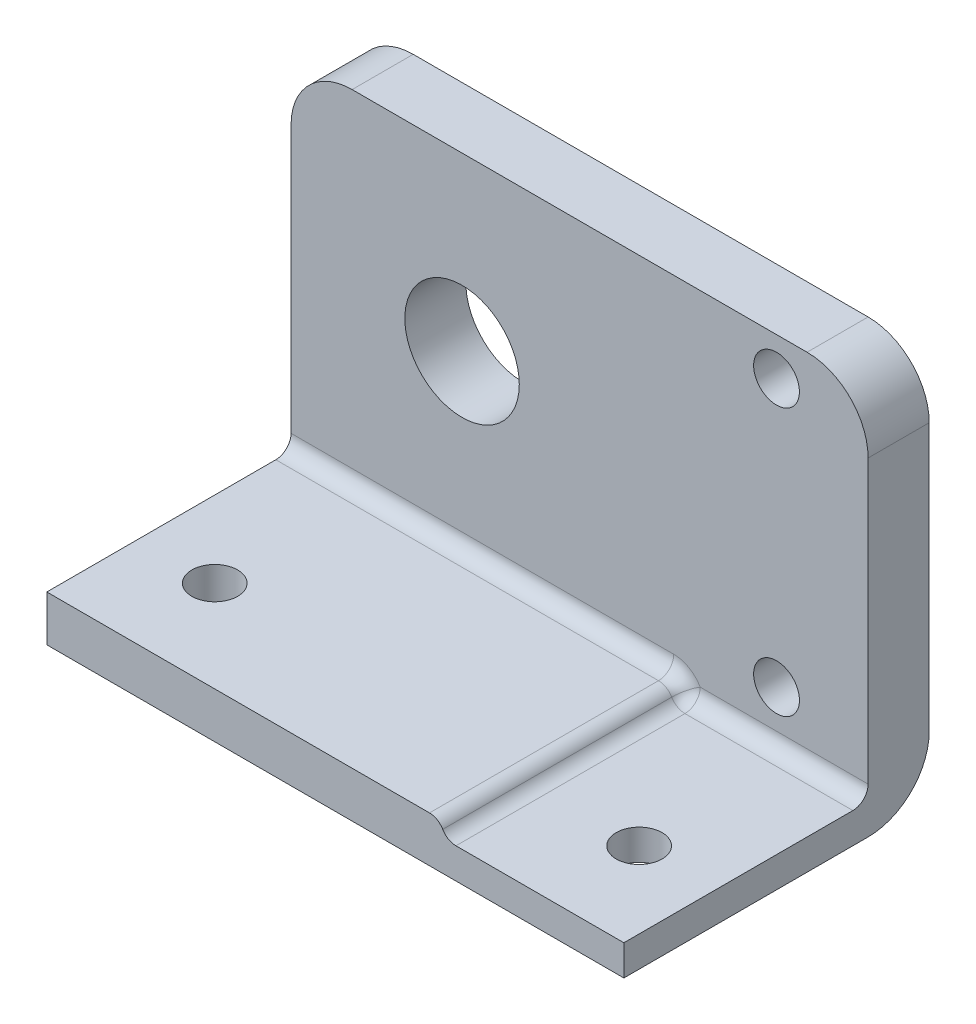
ISO-10303-21;
HEADER;
FILE_DESCRIPTION(('STEP AP214'),'2;1');
FILE_NAME('part.step','',(''),(''),'','','');
FILE_SCHEMA(('AUTOMOTIVE_DESIGN { 1 0 10303 214 1 1 1 1 }'));
ENDSEC;
DATA;
#1=APPLICATION_CONTEXT('core data for automotive mechanical design processes');
#2=APPLICATION_PROTOCOL_DEFINITION('international standard','automotive_design',2000,#1);
#3=PRODUCT_CONTEXT('',#1,'mechanical');
#4=PRODUCT('Part','Part','',(#3));
#5=PRODUCT_RELATED_PRODUCT_CATEGORY('part','',(#4));
#6=PRODUCT_DEFINITION_FORMATION('','',#4);
#7=PRODUCT_DEFINITION_CONTEXT('part definition',#1,'design');
#8=PRODUCT_DEFINITION('design','',#6,#7);
#9=PRODUCT_DEFINITION_SHAPE('','',#8);
#10=(LENGTH_UNIT() NAMED_UNIT(*) SI_UNIT(.MILLI.,.METRE.));
#11=(NAMED_UNIT(*) PLANE_ANGLE_UNIT() SI_UNIT($,.RADIAN.));
#12=(NAMED_UNIT(*) SI_UNIT($,.STERADIAN.) SOLID_ANGLE_UNIT());
#13=UNCERTAINTY_MEASURE_WITH_UNIT(LENGTH_MEASURE(1.E-05),#10,'distance_accuracy_value','');
#14=(GEOMETRIC_REPRESENTATION_CONTEXT(3) GLOBAL_UNCERTAINTY_ASSIGNED_CONTEXT((#13)) GLOBAL_UNIT_ASSIGNED_CONTEXT((#10,
#11,#12)) REPRESENTATION_CONTEXT('',''));
#15=CARTESIAN_POINT('',(0.,0.,0.));
#16=DIRECTION('',(0.,0.,1.));
#17=DIRECTION('',(1.,0.,0.));
#18=AXIS2_PLACEMENT_3D('',#15,#16,#17);
#19=CARTESIAN_POINT('',(0.,0.,0.));
#20=DIRECTION('',(0.,0.,1.));
#21=DIRECTION('',(1.,0.,0.));
#22=AXIS2_PLACEMENT_3D('',#19,#20,#21);
#23=PLANE('',#22);
#24=CARTESIAN_POINT('',(12.9,8.75,0.));
#25=DIRECTION('',(0.,0.,1.));
#26=DIRECTION('',(-1.,0.,0.));
#27=AXIS2_PLACEMENT_3D('',#24,#25,#26);
#28=CIRCLE('',#27,1.50000000000001);
#29=CARTESIAN_POINT('',(11.4,8.75,0.));
#30=VERTEX_POINT('',#29);
#31=EDGE_CURVE('E176',#30,#30,#28,.T.);
#32=ORIENTED_EDGE('',*,*,#31,.F.);
#33=EDGE_LOOP('',(#32));
#34=FACE_BOUND('',#33,.T.);
#35=CARTESIAN_POINT('',(-7.7,0.,0.));
#36=DIRECTION('',(0.,0.,1.));
#37=DIRECTION('',(1.,0.,0.));
#38=AXIS2_PLACEMENT_3D('',#35,#36,#37);
#39=CIRCLE('',#38,3.75);
#40=CARTESIAN_POINT('',(-3.95,0.,0.));
#41=VERTEX_POINT('',#40);
#42=EDGE_CURVE('E164',#41,#41,#39,.T.);
#43=ORIENTED_EDGE('',*,*,#42,.F.);
#44=EDGE_LOOP('',(#43));
#45=FACE_BOUND('',#44,.T.);
#46=CARTESIAN_POINT('',(12.9,-8.75,0.));
#47=DIRECTION('',(0.,0.,1.));
#48=DIRECTION('',(1.,0.,0.));
#49=AXIS2_PLACEMENT_3D('',#46,#47,#48);
#50=CIRCLE('',#49,1.5);
#51=CARTESIAN_POINT('',(14.4,-8.75,0.));
#52=VERTEX_POINT('',#51);
#53=EDGE_CURVE('E181',#52,#52,#50,.T.);
#54=ORIENTED_EDGE('',*,*,#53,.F.);
#55=EDGE_LOOP('',(#54));
#56=FACE_BOUND('',#55,.T.);
#57=CARTESIAN_POINT('',(6.16794919243111,-12.25,0.));
#58=DIRECTION('',(0.,0.,1.));
#59=DIRECTION('',(1.,0.,0.));
#60=AXIS2_PLACEMENT_3D('',#57,#58,#59);
#61=CIRCLE('',#60,2.);
#62=CARTESIAN_POINT('',(7.89999999999999,-11.25,0.));
#63=VERTEX_POINT('',#62);
#64=CARTESIAN_POINT('',(6.16794919243111,-10.25,0.));
#65=VERTEX_POINT('',#64);
#66=EDGE_CURVE('E258',#63,#65,#61,.T.);
#67=ORIENTED_EDGE('',*,*,#66,.F.);
#68=DIRECTION('',(1.,0.,0.));
#69=VECTOR('',#68,1.);
#70=CARTESIAN_POINT('',(18.9,-11.25,0.));
#71=LINE('',#70,#69);
#72=CARTESIAN_POINT('',(18.9,-11.25,0.));
#73=VERTEX_POINT('',#72);
#74=EDGE_CURVE('E253',#63,#73,#71,.T.);
#75=ORIENTED_EDGE('',*,*,#74,.T.);
#76=DIRECTION('',(0.,1.,0.));
#77=VECTOR('',#76,1.);
#78=CARTESIAN_POINT('',(18.9,11.25,0.));
#79=LINE('',#78,#77);
#80=CARTESIAN_POINT('',(18.9,7.25,0.));
#81=VERTEX_POINT('',#80);
#82=EDGE_CURVE('E190',#73,#81,#79,.T.);
#83=ORIENTED_EDGE('',*,*,#82,.T.);
#84=CARTESIAN_POINT('',(14.9,7.25,0.));
#85=DIRECTION('',(0.,0.,1.));
#86=DIRECTION('',(1.,0.,0.));
#87=AXIS2_PLACEMENT_3D('',#84,#85,#86);
#88=CIRCLE('',#87,4.);
#89=CARTESIAN_POINT('',(14.9,11.25,0.));
#90=VERTEX_POINT('',#89);
#91=EDGE_CURVE('E230',#81,#90,#88,.T.);
#92=ORIENTED_EDGE('',*,*,#91,.T.);
#93=DIRECTION('',(-1.,0.,0.));
#94=VECTOR('',#93,1.);
#95=CARTESIAN_POINT('',(-18.9,11.25,0.));
#96=LINE('',#95,#94);
#97=CARTESIAN_POINT('',(-14.9,11.25,0.));
#98=VERTEX_POINT('',#97);
#99=EDGE_CURVE('E203',#90,#98,#96,.T.);
#100=ORIENTED_EDGE('',*,*,#99,.T.);
#101=CARTESIAN_POINT('',(-14.9,7.25,0.));
#102=DIRECTION('',(0.,0.,1.));
#103=DIRECTION('',(1.,0.,0.));
#104=AXIS2_PLACEMENT_3D('',#101,#102,#103);
#105=CIRCLE('',#104,4.);
#106=CARTESIAN_POINT('',(-18.9,7.25,0.));
#107=VERTEX_POINT('',#106);
#108=EDGE_CURVE('E227',#98,#107,#105,.T.);
#109=ORIENTED_EDGE('',*,*,#108,.T.);
#110=DIRECTION('',(0.,-1.,0.));
#111=VECTOR('',#110,1.);
#112=CARTESIAN_POINT('',(-18.9,11.25,0.));
#113=LINE('',#112,#111);
#114=CARTESIAN_POINT('',(-18.9,-10.25,0.));
#115=VERTEX_POINT('',#114);
#116=EDGE_CURVE('E193',#107,#115,#113,.T.);
#117=ORIENTED_EDGE('',*,*,#116,.T.);
#118=DIRECTION('',(1.,0.,0.));
#119=VECTOR('',#118,1.);
#120=CARTESIAN_POINT('',(18.9,-10.25,0.));
#121=LINE('',#120,#119);
#122=EDGE_CURVE('E200',#115,#65,#121,.T.);
#123=ORIENTED_EDGE('',*,*,#122,.T.);
#124=EDGE_LOOP('',(#67,#75,#83,#92,#100,#109,#117,#123));
#125=FACE_BOUND('',#124,.T.);
#126=ADVANCED_FACE('F41',(#34,#45,#56,#125),#23,.T.);
#127=CARTESIAN_POINT('',(18.9,11.25,-4.));
#128=DIRECTION('',(1.,0.,0.));
#129=DIRECTION('',(0.,0.,-1.));
#130=AXIS2_PLACEMENT_3D('',#127,#128,#129);
#131=PLANE('',#130);
#132=ORIENTED_EDGE('',*,*,#82,.F.);
#133=CARTESIAN_POINT('',(18.9,-11.25,1.));
#134=DIRECTION('',(1.,0.,0.));
#135=DIRECTION('',(0.,0.,-1.));
#136=AXIS2_PLACEMENT_3D('',#133,#134,#135);
#137=CIRCLE('',#136,1.);
#138=CARTESIAN_POINT('',(18.9,-12.25,1.));
#139=VERTEX_POINT('',#138);
#140=EDGE_CURVE('E11',#73,#139,#137,.F.);
#141=ORIENTED_EDGE('',*,*,#140,.T.);
#142=DIRECTION('',(0.,0.,1.));
#143=VECTOR('',#142,1.);
#144=CARTESIAN_POINT('',(18.9,-12.25,-14.6866079723341));
#145=LINE('',#144,#143);
#146=CARTESIAN_POINT('',(18.9,-12.25,16.));
#147=VERTEX_POINT('',#146);
#148=EDGE_CURVE('E144',#139,#147,#145,.T.);
#149=ORIENTED_EDGE('',*,*,#148,.T.);
#150=DIRECTION('',(0.,1.,0.));
#151=VECTOR('',#150,1.);
#152=CARTESIAN_POINT('',(18.9,-14.25,16.));
#153=LINE('',#152,#151);
#154=CARTESIAN_POINT('',(18.9,-14.25,16.));
#155=VERTEX_POINT('',#154);
#156=EDGE_CURVE('E148',#155,#147,#153,.T.);
#157=ORIENTED_EDGE('',*,*,#156,.F.);
#158=DIRECTION('',(0.,0.,1.));
#159=VECTOR('',#158,1.);
#160=CARTESIAN_POINT('',(18.9,-14.25,-4.));
#161=LINE('',#160,#159);
#162=CARTESIAN_POINT('',(18.9,-14.25,0.));
#163=VERTEX_POINT('',#162);
#164=EDGE_CURVE('E327',#163,#155,#161,.T.);
#165=ORIENTED_EDGE('',*,*,#164,.F.);
#166=CARTESIAN_POINT('',(18.9,-10.25,0.));
#167=DIRECTION('',(1.,0.,0.));
#168=DIRECTION('',(0.,0.,-1.));
#169=AXIS2_PLACEMENT_3D('',#166,#167,#168);
#170=CIRCLE('',#169,4.);
#171=CARTESIAN_POINT('',(18.9,-10.25,-4.));
#172=VERTEX_POINT('',#171);
#173=EDGE_CURVE('E212',#163,#172,#170,.T.);
#174=ORIENTED_EDGE('',*,*,#173,.T.);
#175=DIRECTION('',(0.,1.,0.));
#176=VECTOR('',#175,1.);
#177=CARTESIAN_POINT('',(18.9,11.25,-4.));
#178=LINE('',#177,#176);
#179=CARTESIAN_POINT('',(18.9,7.25,-4.));
#180=VERTEX_POINT('',#179);
#181=EDGE_CURVE('E188',#172,#180,#178,.T.);
#182=ORIENTED_EDGE('',*,*,#181,.T.);
#183=DIRECTION('',(0.,0.,1.));
#184=VECTOR('',#183,1.);
#185=CARTESIAN_POINT('',(18.9,7.25,-4.));
#186=LINE('',#185,#184);
#187=EDGE_CURVE('E222',#180,#81,#186,.T.);
#188=ORIENTED_EDGE('',*,*,#187,.T.);
#189=EDGE_LOOP('',(#132,#141,#149,#157,#165,#174,#182,#188));
#190=FACE_BOUND('',#189,.T.);
#191=ADVANCED_FACE('F149',(#190),#131,.T.);
#192=CARTESIAN_POINT('',(0.,-11.25,0.));
#193=DIRECTION('',(0.,1.,0.));
#194=DIRECTION('',(0.,0.,1.));
#195=AXIS2_PLACEMENT_3D('',#192,#193,#194);
#196=PLANE('',#195);
#197=CARTESIAN_POINT('',(-13.9,-11.25,10.));
#198=DIRECTION('',(0.,-1.,0.));
#199=DIRECTION('',(0.,0.,-1.));
#200=AXIS2_PLACEMENT_3D('',#197,#198,#199);
#201=CIRCLE('',#200,1.5);
#202=CARTESIAN_POINT('',(-13.9,-11.25,8.5));
#203=VERTEX_POINT('',#202);
#204=EDGE_CURVE('E323',#203,#203,#201,.T.);
#205=ORIENTED_EDGE('',*,*,#204,.T.);
#206=EDGE_LOOP('',(#205));
#207=FACE_BOUND('',#206,.T.);
#208=DIRECTION('',(-1.,0.,0.));
#209=VECTOR('',#208,1.);
#210=CARTESIAN_POINT('',(-18.9,-11.25,16.));
#211=LINE('',#210,#209);
#212=CARTESIAN_POINT('',(6.16794919243111,-11.25,16.));
#213=VERTEX_POINT('',#212);
#214=CARTESIAN_POINT('',(-18.9,-11.25,16.));
#215=VERTEX_POINT('',#214);
#216=EDGE_CURVE('E311',#213,#215,#211,.T.);
#217=ORIENTED_EDGE('',*,*,#216,.F.);
#218=DIRECTION('',(0.,0.,1.));
#219=VECTOR('',#218,1.);
#220=CARTESIAN_POINT('',(6.16794919243111,-11.25,1.));
#221=LINE('',#220,#219);
#222=CARTESIAN_POINT('',(6.16794919243111,-11.25,1.));
#223=VERTEX_POINT('',#222);
#224=EDGE_CURVE('E249',#213,#223,#221,.F.);
#225=ORIENTED_EDGE('',*,*,#224,.T.);
#226=DIRECTION('',(1.,0.,0.));
#227=VECTOR('',#226,1.);
#228=CARTESIAN_POINT('',(-18.9,-11.25,1.));
#229=LINE('',#228,#227);
#230=CARTESIAN_POINT('',(-18.9,-11.25,1.));
#231=VERTEX_POINT('',#230);
#232=EDGE_CURVE('E210',#223,#231,#229,.F.);
#233=ORIENTED_EDGE('',*,*,#232,.T.);
#234=DIRECTION('',(0.,0.,-1.));
#235=VECTOR('',#234,1.);
#236=CARTESIAN_POINT('',(-18.9,-11.25,-4.));
#237=LINE('',#236,#235);
#238=EDGE_CURVE('E301',#215,#231,#237,.T.);
#239=ORIENTED_EDGE('',*,*,#238,.F.);
#240=EDGE_LOOP('',(#217,#225,#233,#239));
#241=FACE_BOUND('',#240,.T.);
#242=ADVANCED_FACE('F309',(#207,#241),#196,.T.);
#243=CARTESIAN_POINT('',(13.9,-14.25,10.));
#244=DIRECTION('',(0.,1.,0.));
#245=DIRECTION('',(0.,0.,1.));
#246=AXIS2_PLACEMENT_3D('',#243,#244,#245);
#247=CYLINDRICAL_SURFACE('',#246,1.5);
#248=CARTESIAN_POINT('',(13.9,-14.25,10.));
#249=DIRECTION('',(0.,-1.,0.));
#250=DIRECTION('',(0.,0.,-1.));
#251=AXIS2_PLACEMENT_3D('',#248,#249,#250);
#252=CIRCLE('',#251,1.5);
#253=CARTESIAN_POINT('',(13.9,-14.25,8.5));
#254=VERTEX_POINT('',#253);
#255=EDGE_CURVE('E242',#254,#254,#252,.T.);
#256=ORIENTED_EDGE('',*,*,#255,.T.);
#257=EDGE_LOOP('',(#256));
#258=FACE_BOUND('',#257,.T.);
#259=CARTESIAN_POINT('',(13.9,-12.25,10.));
#260=DIRECTION('',(0.,1.,0.));
#261=DIRECTION('',(-1.,0.,0.));
#262=AXIS2_PLACEMENT_3D('',#259,#260,#261);
#263=CIRCLE('',#262,1.5);
#264=CARTESIAN_POINT('',(12.4,-12.25,10.));
#265=VERTEX_POINT('',#264);
#266=EDGE_CURVE('E153',#265,#265,#263,.T.);
#267=ORIENTED_EDGE('',*,*,#266,.T.);
#268=EDGE_LOOP('',(#267));
#269=FACE_BOUND('',#268,.T.);
#270=ADVANCED_FACE('F337',(#258,#269),#247,.F.);
#271=CARTESIAN_POINT('',(0.,-10.25,1.));
#272=DIRECTION('',(-1.,0.,0.));
#273=DIRECTION('',(0.,0.,1.));
#274=AXIS2_PLACEMENT_3D('',#271,#272,#273);
#275=CYLINDRICAL_SURFACE('',#274,1.);
#276=ORIENTED_EDGE('',*,*,#232,.F.);
#277=CARTESIAN_POINT('',(6.16794919243111,-10.25,1.));
#278=DIRECTION('',(1.,0.,0.));
#279=DIRECTION('',(0.,0.,-1.));
#280=AXIS2_PLACEMENT_3D('',#277,#278,#279);
#281=CIRCLE('',#280,1.);
#282=EDGE_CURVE('E49',#223,#65,#281,.T.);
#283=ORIENTED_EDGE('',*,*,#282,.T.);
#284=ORIENTED_EDGE('',*,*,#122,.F.);
#285=CARTESIAN_POINT('',(-18.9,-10.25,1.));
#286=DIRECTION('',(-1.,0.,0.));
#287=DIRECTION('',(0.,0.,1.));
#288=AXIS2_PLACEMENT_3D('',#285,#286,#287);
#289=CIRCLE('',#288,1.);
#290=EDGE_CURVE('E209',#231,#115,#289,.F.);
#291=ORIENTED_EDGE('',*,*,#290,.F.);
#292=EDGE_LOOP('',(#276,#283,#284,#291));
#293=FACE_BOUND('',#292,.T.);
#294=ADVANCED_FACE('F302',(#293),#275,.F.);
#295=CARTESIAN_POINT('',(-18.9,11.25,-4.));
#296=DIRECTION('',(-1.,0.,0.));
#297=DIRECTION('',(0.,0.,1.));
#298=AXIS2_PLACEMENT_3D('',#295,#296,#297);
#299=PLANE('',#298);
#300=ORIENTED_EDGE('',*,*,#116,.F.);
#301=DIRECTION('',(0.,0.,1.));
#302=VECTOR('',#301,1.);
#303=CARTESIAN_POINT('',(-18.9,7.25,-4.));
#304=LINE('',#303,#302);
#305=CARTESIAN_POINT('',(-18.9,7.25,-4.));
#306=VERTEX_POINT('',#305);
#307=EDGE_CURVE('E239',#107,#306,#304,.F.);
#308=ORIENTED_EDGE('',*,*,#307,.T.);
#309=DIRECTION('',(0.,-1.,0.));
#310=VECTOR('',#309,1.);
#311=CARTESIAN_POINT('',(-18.9,11.25,-4.));
#312=LINE('',#311,#310);
#313=CARTESIAN_POINT('',(-18.9,-10.25,-4.));
#314=VERTEX_POINT('',#313);
#315=EDGE_CURVE('E199',#306,#314,#312,.T.);
#316=ORIENTED_EDGE('',*,*,#315,.T.);
#317=CARTESIAN_POINT('',(-18.9,-10.25,0.));
#318=DIRECTION('',(-1.,0.,0.));
#319=DIRECTION('',(0.,0.,1.));
#320=AXIS2_PLACEMENT_3D('',#317,#318,#319);
#321=CIRCLE('',#320,4.);
#322=CARTESIAN_POINT('',(-18.9,-14.25,0.));
#323=VERTEX_POINT('',#322);
#324=EDGE_CURVE('E225',#314,#323,#321,.T.);
#325=ORIENTED_EDGE('',*,*,#324,.T.);
#326=DIRECTION('',(0.,0.,-1.));
#327=VECTOR('',#326,1.);
#328=CARTESIAN_POINT('',(-18.9,-14.25,-4.));
#329=LINE('',#328,#327);
#330=CARTESIAN_POINT('',(-18.9,-14.25,16.));
#331=VERTEX_POINT('',#330);
#332=EDGE_CURVE('E316',#331,#323,#329,.T.);
#333=ORIENTED_EDGE('',*,*,#332,.F.);
#334=DIRECTION('',(0.,1.,0.));
#335=VECTOR('',#334,1.);
#336=CARTESIAN_POINT('',(-18.9,-14.25,16.));
#337=LINE('',#336,#335);
#338=EDGE_CURVE('E168',#331,#215,#337,.T.);
#339=ORIENTED_EDGE('',*,*,#338,.T.);
#340=ORIENTED_EDGE('',*,*,#238,.T.);
#341=ORIENTED_EDGE('',*,*,#290,.T.);
#342=EDGE_LOOP('',(#300,#308,#316,#325,#333,#339,#340,#341));
#343=FACE_BOUND('',#342,.T.);
#344=ADVANCED_FACE('F294',(#343),#299,.T.);
#345=CARTESIAN_POINT('',(-18.9,11.25,-4.));
#346=DIRECTION('',(0.,1.,0.));
#347=DIRECTION('',(0.,0.,1.));
#348=AXIS2_PLACEMENT_3D('',#345,#346,#347);
#349=PLANE('',#348);
#350=ORIENTED_EDGE('',*,*,#99,.F.);
#351=DIRECTION('',(0.,0.,1.));
#352=VECTOR('',#351,1.);
#353=CARTESIAN_POINT('',(14.9,11.25,-4.));
#354=LINE('',#353,#352);
#355=CARTESIAN_POINT('',(14.9,11.25,-4.));
#356=VERTEX_POINT('',#355);
#357=EDGE_CURVE('E234',#90,#356,#354,.F.);
#358=ORIENTED_EDGE('',*,*,#357,.T.);
#359=DIRECTION('',(-1.,0.,0.));
#360=VECTOR('',#359,1.);
#361=CARTESIAN_POINT('',(-18.9,11.25,-4.));
#362=LINE('',#361,#360);
#363=CARTESIAN_POINT('',(-14.9,11.25,-4.));
#364=VERTEX_POINT('',#363);
#365=EDGE_CURVE('E195',#356,#364,#362,.T.);
#366=ORIENTED_EDGE('',*,*,#365,.T.);
#367=DIRECTION('',(0.,0.,1.));
#368=VECTOR('',#367,1.);
#369=CARTESIAN_POINT('',(-14.9,11.25,-4.));
#370=LINE('',#369,#368);
#371=EDGE_CURVE('E233',#364,#98,#370,.T.);
#372=ORIENTED_EDGE('',*,*,#371,.T.);
#373=EDGE_LOOP('',(#350,#358,#366,#372));
#374=FACE_BOUND('',#373,.T.);
#375=ADVANCED_FACE('F288',(#374),#349,.T.);
#376=CARTESIAN_POINT('',(0.,0.,-4.));
#377=DIRECTION('',(0.,0.,1.));
#378=DIRECTION('',(1.,0.,0.));
#379=AXIS2_PLACEMENT_3D('',#376,#377,#378);
#380=PLANE('',#379);
#381=CARTESIAN_POINT('',(-7.7,0.,-4.));
#382=DIRECTION('',(0.,0.,1.));
#383=DIRECTION('',(1.,0.,0.));
#384=AXIS2_PLACEMENT_3D('',#381,#382,#383);
#385=CIRCLE('',#384,3.75);
#386=CARTESIAN_POINT('',(-3.95,0.,-4.));
#387=VERTEX_POINT('',#386);
#388=EDGE_CURVE('E169',#387,#387,#385,.T.);
#389=ORIENTED_EDGE('',*,*,#388,.T.);
#390=EDGE_LOOP('',(#389));
#391=FACE_BOUND('',#390,.T.);
#392=CARTESIAN_POINT('',(12.9,8.75,-4.));
#393=DIRECTION('',(0.,0.,1.));
#394=DIRECTION('',(-1.,0.,0.));
#395=AXIS2_PLACEMENT_3D('',#392,#393,#394);
#396=CIRCLE('',#395,1.50000000000001);
#397=CARTESIAN_POINT('',(11.4,8.75,-4.));
#398=VERTEX_POINT('',#397);
#399=EDGE_CURVE('E178',#398,#398,#396,.T.);
#400=ORIENTED_EDGE('',*,*,#399,.T.);
#401=EDGE_LOOP('',(#400));
#402=FACE_BOUND('',#401,.T.);
#403=ORIENTED_EDGE('',*,*,#365,.F.);
#404=CARTESIAN_POINT('',(14.9,7.25,-4.));
#405=DIRECTION('',(0.,0.,1.));
#406=DIRECTION('',(1.,0.,0.));
#407=AXIS2_PLACEMENT_3D('',#404,#405,#406);
#408=CIRCLE('',#407,4.);
#409=EDGE_CURVE('E238',#356,#180,#408,.F.);
#410=ORIENTED_EDGE('',*,*,#409,.T.);
#411=ORIENTED_EDGE('',*,*,#181,.F.);
#412=DIRECTION('',(1.,0.,0.));
#413=VECTOR('',#412,1.);
#414=CARTESIAN_POINT('',(0.,-10.25,-4.));
#415=LINE('',#414,#413);
#416=CARTESIAN_POINT('',(12.9,-10.25,-4.));
#417=VERTEX_POINT('',#416);
#418=EDGE_CURVE('E216',#172,#417,#415,.F.);
#419=ORIENTED_EDGE('',*,*,#418,.T.);
#420=CARTESIAN_POINT('',(12.9,-8.75,-4.));
#421=DIRECTION('',(0.,0.,1.));
#422=DIRECTION('',(1.,0.,0.));
#423=AXIS2_PLACEMENT_3D('',#420,#421,#422);
#424=CIRCLE('',#423,1.5);
#425=EDGE_CURVE('E183',#417,#417,#424,.T.);
#426=ORIENTED_EDGE('',*,*,#425,.T.);
#427=DIRECTION('',(1.,0.,0.));
#428=VECTOR('',#427,1.);
#429=CARTESIAN_POINT('',(0.,-10.25,-4.));
#430=LINE('',#429,#428);
#431=EDGE_CURVE('E219',#417,#314,#430,.F.);
#432=ORIENTED_EDGE('',*,*,#431,.T.);
#433=ORIENTED_EDGE('',*,*,#315,.F.);
#434=CARTESIAN_POINT('',(-14.9,7.25,-4.));
#435=DIRECTION('',(0.,0.,1.));
#436=DIRECTION('',(1.,0.,0.));
#437=AXIS2_PLACEMENT_3D('',#434,#435,#436);
#438=CIRCLE('',#437,4.);
#439=EDGE_CURVE('E236',#306,#364,#438,.F.);
#440=ORIENTED_EDGE('',*,*,#439,.T.);
#441=EDGE_LOOP('',(#403,#410,#411,#419,#426,#432,#433,#440));
#442=FACE_BOUND('',#441,.T.);
#443=ADVANCED_FACE('F367',(#391,#402,#442),#380,.F.);
#444=CARTESIAN_POINT('',(12.9,-8.75,-4.));
#445=DIRECTION('',(0.,0.,1.));
#446=DIRECTION('',(1.,0.,0.));
#447=AXIS2_PLACEMENT_3D('',#444,#445,#446);
#448=CYLINDRICAL_SURFACE('',#447,1.5);
#449=ORIENTED_EDGE('',*,*,#425,.F.);
#450=EDGE_LOOP('',(#449));
#451=FACE_BOUND('',#450,.T.);
#452=ORIENTED_EDGE('',*,*,#53,.T.);
#453=EDGE_LOOP('',(#452));
#454=FACE_BOUND('',#453,.T.);
#455=ADVANCED_FACE('F511',(#451,#454),#448,.F.);
#456=CARTESIAN_POINT('',(12.9,8.75,-4.));
#457=DIRECTION('',(0.,0.,1.));
#458=DIRECTION('',(1.,0.,0.));
#459=AXIS2_PLACEMENT_3D('',#456,#457,#458);
#460=CYLINDRICAL_SURFACE('',#459,1.50000000000001);
#461=ORIENTED_EDGE('',*,*,#399,.F.);
#462=EDGE_LOOP('',(#461));
#463=FACE_BOUND('',#462,.T.);
#464=ORIENTED_EDGE('',*,*,#31,.T.);
#465=EDGE_LOOP('',(#464));
#466=FACE_BOUND('',#465,.T.);
#467=ADVANCED_FACE('F355',(#463,#466),#460,.F.);
#468=CARTESIAN_POINT('',(-7.7,0.,-4.));
#469=DIRECTION('',(0.,0.,1.));
#470=DIRECTION('',(1.,0.,0.));
#471=AXIS2_PLACEMENT_3D('',#468,#469,#470);
#472=CYLINDRICAL_SURFACE('',#471,3.75);
#473=ORIENTED_EDGE('',*,*,#388,.F.);
#474=EDGE_LOOP('',(#473));
#475=FACE_BOUND('',#474,.T.);
#476=ORIENTED_EDGE('',*,*,#42,.T.);
#477=EDGE_LOOP('',(#476));
#478=FACE_BOUND('',#477,.T.);
#479=ADVANCED_FACE('F344',(#475,#478),#472,.F.);
#480=CARTESIAN_POINT('',(0.,-14.25,0.));
#481=DIRECTION('',(0.,1.,0.));
#482=DIRECTION('',(0.,0.,1.));
#483=AXIS2_PLACEMENT_3D('',#480,#481,#482);
#484=PLANE('',#483);
#485=ORIENTED_EDGE('',*,*,#332,.T.);
#486=DIRECTION('',(1.,0.,0.));
#487=VECTOR('',#486,1.);
#488=CARTESIAN_POINT('',(0.,-14.25,0.));
#489=LINE('',#488,#487);
#490=EDGE_CURVE('E211',#323,#163,#489,.T.);
#491=ORIENTED_EDGE('',*,*,#490,.T.);
#492=ORIENTED_EDGE('',*,*,#164,.T.);
#493=DIRECTION('',(-1.,0.,0.));
#494=VECTOR('',#493,1.);
#495=CARTESIAN_POINT('',(-18.9,-14.25,16.));
#496=LINE('',#495,#494);
#497=EDGE_CURVE('E165',#155,#331,#496,.T.);
#498=ORIENTED_EDGE('',*,*,#497,.T.);
#499=EDGE_LOOP('',(#485,#491,#492,#498));
#500=FACE_BOUND('',#499,.T.);
#501=CARTESIAN_POINT('',(-13.9,-14.25,10.));
#502=DIRECTION('',(0.,-1.,0.));
#503=DIRECTION('',(0.,0.,-1.));
#504=AXIS2_PLACEMENT_3D('',#501,#502,#503);
#505=CIRCLE('',#504,1.5);
#506=CARTESIAN_POINT('',(-13.9,-14.25,8.5));
#507=VERTEX_POINT('',#506);
#508=EDGE_CURVE('E324',#507,#507,#505,.T.);
#509=ORIENTED_EDGE('',*,*,#508,.F.);
#510=EDGE_LOOP('',(#509));
#511=FACE_BOUND('',#510,.T.);
#512=ORIENTED_EDGE('',*,*,#255,.F.);
#513=EDGE_LOOP('',(#512));
#514=FACE_BOUND('',#513,.T.);
#515=ADVANCED_FACE('F339',(#500,#511,#514),#484,.F.);
#516=CARTESIAN_POINT('',(-18.9,-14.25,16.));
#517=DIRECTION('',(0.,0.,-1.));
#518=DIRECTION('',(-1.,0.,0.));
#519=AXIS2_PLACEMENT_3D('',#516,#517,#518);
#520=PLANE('',#519);
#521=CARTESIAN_POINT('',(7.89999999999999,-11.25,16.));
#522=DIRECTION('',(0.,0.,-1.));
#523=DIRECTION('',(-1.,0.,0.));
#524=AXIS2_PLACEMENT_3D('',#521,#522,#523);
#525=CIRCLE('',#524,1.);
#526=CARTESIAN_POINT('',(7.89999999999999,-12.25,16.));
#527=VERTEX_POINT('',#526);
#528=CARTESIAN_POINT('',(7.03397459621555,-11.75,16.));
#529=VERTEX_POINT('',#528);
#530=EDGE_CURVE('E246',#527,#529,#525,.T.);
#531=ORIENTED_EDGE('',*,*,#530,.T.);
#532=CARTESIAN_POINT('',(6.16794919243111,-12.25,16.));
#533=DIRECTION('',(0.,0.,-1.));
#534=DIRECTION('',(-1.,0.,0.));
#535=AXIS2_PLACEMENT_3D('',#532,#533,#534);
#536=CIRCLE('',#535,1.);
#537=EDGE_CURVE('E254',#529,#213,#536,.F.);
#538=ORIENTED_EDGE('',*,*,#537,.T.);
#539=ORIENTED_EDGE('',*,*,#216,.T.);
#540=ORIENTED_EDGE('',*,*,#338,.F.);
#541=ORIENTED_EDGE('',*,*,#497,.F.);
#542=ORIENTED_EDGE('',*,*,#156,.T.);
#543=DIRECTION('',(-1.,0.,0.));
#544=VECTOR('',#543,1.);
#545=CARTESIAN_POINT('',(0.,-12.25,16.));
#546=LINE('',#545,#544);
#547=EDGE_CURVE('E154',#147,#527,#546,.T.);
#548=ORIENTED_EDGE('',*,*,#547,.T.);
#549=EDGE_LOOP('',(#531,#538,#539,#540,#541,#542,#548));
#550=FACE_BOUND('',#549,.T.);
#551=ADVANCED_FACE('F162',(#550),#520,.F.);
#552=CARTESIAN_POINT('',(-13.9,-14.25,10.));
#553=DIRECTION('',(0.,1.,0.));
#554=DIRECTION('',(0.,0.,1.));
#555=AXIS2_PLACEMENT_3D('',#552,#553,#554);
#556=CYLINDRICAL_SURFACE('',#555,1.5);
#557=ORIENTED_EDGE('',*,*,#508,.T.);
#558=EDGE_LOOP('',(#557));
#559=FACE_BOUND('',#558,.T.);
#560=ORIENTED_EDGE('',*,*,#204,.F.);
#561=EDGE_LOOP('',(#560));
#562=FACE_BOUND('',#561,.T.);
#563=ADVANCED_FACE('F350',(#559,#562),#556,.F.);
#564=CARTESIAN_POINT('',(0.,-10.25,0.));
#565=DIRECTION('',(1.,0.,0.));
#566=DIRECTION('',(0.,0.,-1.));
#567=AXIS2_PLACEMENT_3D('',#564,#565,#566);
#568=CYLINDRICAL_SURFACE('',#567,4.);
#569=ORIENTED_EDGE('',*,*,#431,.F.);
#570=ORIENTED_EDGE('',*,*,#418,.F.);
#571=ORIENTED_EDGE('',*,*,#173,.F.);
#572=ORIENTED_EDGE('',*,*,#490,.F.);
#573=ORIENTED_EDGE('',*,*,#324,.F.);
#574=EDGE_LOOP('',(#569,#570,#571,#572,#573));
#575=FACE_BOUND('',#574,.T.);
#576=ADVANCED_FACE('F380',(#575),#568,.T.);
#577=CARTESIAN_POINT('',(14.9,7.25,-4.));
#578=DIRECTION('',(0.,0.,1.));
#579=DIRECTION('',(1.,0.,0.));
#580=AXIS2_PLACEMENT_3D('',#577,#578,#579);
#581=CYLINDRICAL_SURFACE('',#580,4.);
#582=ORIENTED_EDGE('',*,*,#409,.F.);
#583=ORIENTED_EDGE('',*,*,#357,.F.);
#584=ORIENTED_EDGE('',*,*,#91,.F.);
#585=ORIENTED_EDGE('',*,*,#187,.F.);
#586=EDGE_LOOP('',(#582,#583,#584,#585));
#587=FACE_BOUND('',#586,.T.);
#588=ADVANCED_FACE('F284',(#587),#581,.T.);
#589=CARTESIAN_POINT('',(-14.9,7.25,-4.));
#590=DIRECTION('',(0.,0.,1.));
#591=DIRECTION('',(1.,0.,0.));
#592=AXIS2_PLACEMENT_3D('',#589,#590,#591);
#593=CYLINDRICAL_SURFACE('',#592,4.);
#594=ORIENTED_EDGE('',*,*,#439,.F.);
#595=ORIENTED_EDGE('',*,*,#307,.F.);
#596=ORIENTED_EDGE('',*,*,#108,.F.);
#597=ORIENTED_EDGE('',*,*,#371,.F.);
#598=EDGE_LOOP('',(#594,#595,#596,#597));
#599=FACE_BOUND('',#598,.T.);
#600=ADVANCED_FACE('F293',(#599),#593,.T.);
#601=CARTESIAN_POINT('',(0.,-12.25,-14.6866079723341));
#602=DIRECTION('',(0.,1.,0.));
#603=DIRECTION('',(-1.,0.,0.));
#604=AXIS2_PLACEMENT_3D('',#601,#602,#603);
#605=PLANE('',#604);
#606=ORIENTED_EDGE('',*,*,#266,.F.);
#607=EDGE_LOOP('',(#606));
#608=FACE_BOUND('',#607,.T.);
#609=ORIENTED_EDGE('',*,*,#148,.F.);
#610=DIRECTION('',(1.,0.,0.));
#611=VECTOR('',#610,1.);
#612=CARTESIAN_POINT('',(7.89999999999999,-12.25,1.));
#613=LINE('',#612,#611);
#614=CARTESIAN_POINT('',(7.89999999999999,-12.25,1.));
#615=VERTEX_POINT('',#614);
#616=EDGE_CURVE('E65',#139,#615,#613,.F.);
#617=ORIENTED_EDGE('',*,*,#616,.T.);
#618=DIRECTION('',(0.,0.,1.));
#619=VECTOR('',#618,1.);
#620=CARTESIAN_POINT('',(7.89999999999999,-12.25,16.));
#621=LINE('',#620,#619);
#622=EDGE_CURVE('E158',#615,#527,#621,.T.);
#623=ORIENTED_EDGE('',*,*,#622,.T.);
#624=ORIENTED_EDGE('',*,*,#547,.F.);
#625=EDGE_LOOP('',(#609,#617,#623,#624));
#626=FACE_BOUND('',#625,.T.);
#627=ADVANCED_FACE('F151',(#608,#626),#605,.T.);
#628=CARTESIAN_POINT('',(7.89999999999999,-11.25,-14.6866079723341));
#629=DIRECTION('',(0.,0.,-1.));
#630=DIRECTION('',(-1.,0.,0.));
#631=AXIS2_PLACEMENT_3D('',#628,#629,#630);
#632=CYLINDRICAL_SURFACE('',#631,1.);
#633=ORIENTED_EDGE('',*,*,#622,.F.);
#634=CARTESIAN_POINT('',(7.89999999999999,-11.25,1.));
#635=DIRECTION('',(0.,0.,-1.));
#636=DIRECTION('',(-1.,0.,0.));
#637=AXIS2_PLACEMENT_3D('',#634,#635,#636);
#638=CIRCLE('',#637,1.);
#639=CARTESIAN_POINT('',(7.03397459621555,-11.75,1.));
#640=VERTEX_POINT('',#639);
#641=EDGE_CURVE('E264',#615,#640,#638,.T.);
#642=ORIENTED_EDGE('',*,*,#641,.T.);
#643=DIRECTION('',(0.,0.,-1.));
#644=VECTOR('',#643,1.);
#645=CARTESIAN_POINT('',(7.03397459621555,-11.75,-14.6866079723341));
#646=LINE('',#645,#644);
#647=EDGE_CURVE('E247',#640,#529,#646,.F.);
#648=ORIENTED_EDGE('',*,*,#647,.T.);
#649=ORIENTED_EDGE('',*,*,#530,.F.);
#650=EDGE_LOOP('',(#633,#642,#648,#649));
#651=FACE_BOUND('',#650,.T.);
#652=ADVANCED_FACE('F320',(#651),#632,.F.);
#653=CARTESIAN_POINT('',(6.16794919243111,-12.25,-14.6866079723341));
#654=DIRECTION('',(0.,0.,-1.));
#655=DIRECTION('',(-1.,0.,0.));
#656=AXIS2_PLACEMENT_3D('',#653,#654,#655);
#657=CYLINDRICAL_SURFACE('',#656,1.);
#658=ORIENTED_EDGE('',*,*,#537,.F.);
#659=ORIENTED_EDGE('',*,*,#647,.F.);
#660=CARTESIAN_POINT('',(6.16794919243111,-12.25,1.));
#661=DIRECTION('',(0.,0.,-1.));
#662=DIRECTION('',(-1.,0.,0.));
#663=AXIS2_PLACEMENT_3D('',#660,#661,#662);
#664=CIRCLE('',#663,1.);
#665=EDGE_CURVE('E159',#223,#640,#664,.T.);
#666=ORIENTED_EDGE('',*,*,#665,.F.);
#667=ORIENTED_EDGE('',*,*,#224,.F.);
#668=EDGE_LOOP('',(#658,#659,#666,#667));
#669=FACE_BOUND('',#668,.T.);
#670=ADVANCED_FACE('F314',(#669),#657,.T.);
#671=CARTESIAN_POINT('',(0.,-11.25,1.));
#672=DIRECTION('',(-1.,0.,0.));
#673=DIRECTION('',(0.,-1.,0.));
#674=AXIS2_PLACEMENT_3D('',#671,#672,#673);
#675=CYLINDRICAL_SURFACE('',#674,1.);
#676=ORIENTED_EDGE('',*,*,#140,.F.);
#677=ORIENTED_EDGE('',*,*,#74,.F.);
#678=CARTESIAN_POINT('',(7.89999999999999,-11.25,1.));
#679=DIRECTION('',(1.,0.,0.));
#680=DIRECTION('',(0.,0.,-1.));
#681=AXIS2_PLACEMENT_3D('',#678,#679,#680);
#682=CIRCLE('',#681,1.);
#683=EDGE_CURVE('E44',#615,#63,#682,.T.);
#684=ORIENTED_EDGE('',*,*,#683,.F.);
#685=ORIENTED_EDGE('',*,*,#616,.F.);
#686=EDGE_LOOP('',(#676,#677,#684,#685));
#687=FACE_BOUND('',#686,.T.);
#688=ADVANCED_FACE('F43',(#687),#675,.F.);
#689=CARTESIAN_POINT('',(7.89999999999999,-11.25,1.));
#690=DIRECTION('',(0.,0.,1.));
#691=DIRECTION('',(1.,0.,0.));
#692=AXIS2_PLACEMENT_3D('',#689,#690,#691);
#693=SPHERICAL_SURFACE('',#692,1.);
#694=ORIENTED_EDGE('',*,*,#641,.F.);
#695=ORIENTED_EDGE('',*,*,#683,.T.);
#696=CARTESIAN_POINT('',(7.89999999999999,-11.25,1.));
#697=DIRECTION('',(0.499999999999999,-0.866025403784439,0.));
#698=DIRECTION('',(0.866025403784439,0.499999999999999,0.));
#699=AXIS2_PLACEMENT_3D('',#696,#697,#698);
#700=CIRCLE('',#699,1.);
#701=EDGE_CURVE('E261',#640,#63,#700,.T.);
#702=ORIENTED_EDGE('',*,*,#701,.F.);
#703=EDGE_LOOP('',(#694,#695,#702));
#704=FACE_BOUND('',#703,.T.);
#705=ADVANCED_FACE('F271',(#704),#693,.F.);
#706=CARTESIAN_POINT('',(6.16794919243111,-12.25,1.));
#707=DIRECTION('',(0.,0.,1.));
#708=DIRECTION('',(1.,0.,0.));
#709=AXIS2_PLACEMENT_3D('',#706,#707,#708);
#710=TOROIDAL_SURFACE('',#709,2.,1.);
#711=ORIENTED_EDGE('',*,*,#665,.T.);
#712=ORIENTED_EDGE('',*,*,#701,.T.);
#713=ORIENTED_EDGE('',*,*,#66,.T.);
#714=ORIENTED_EDGE('',*,*,#282,.F.);
#715=EDGE_LOOP('',(#711,#712,#713,#714));
#716=FACE_BOUND('',#715,.T.);
#717=ADVANCED_FACE('F304',(#716),#710,.F.);
#718=CLOSED_SHELL('',(#126,#191,#242,#270,#294,#344,#375,#443,#455,#467,#479,#515,#551,#563,
#576,#588,#600,#627,#652,#670,#688,#705,#717));
#719=MANIFOLD_SOLID_BREP('B2',#718);
#720=ADVANCED_BREP_SHAPE_REPRESENTATION('',(#18,#719),#14);
#721=SHAPE_DEFINITION_REPRESENTATION(#9,#720);
ENDSEC;
END-ISO-10303-21;
